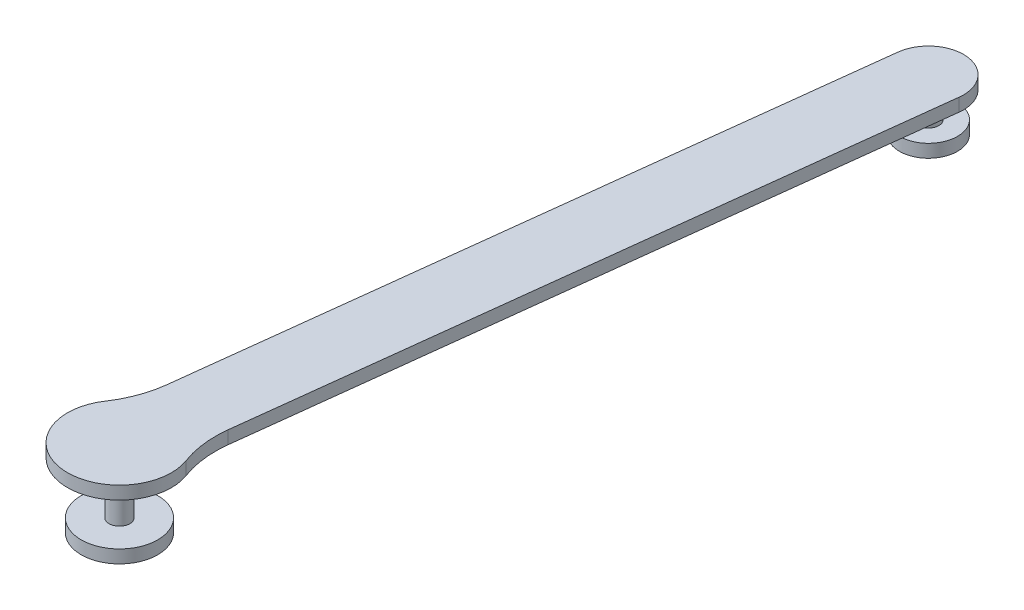
ISO-10303-21;
HEADER;
FILE_DESCRIPTION(('STEP AP214'),'2;1');
FILE_NAME('part.step','',(''),(''),'','','');
FILE_SCHEMA(('AUTOMOTIVE_DESIGN { 1 0 10303 214 1 1 1 1 }'));
ENDSEC;
DATA;
#1=APPLICATION_CONTEXT('core data for automotive mechanical design processes');
#2=APPLICATION_PROTOCOL_DEFINITION('international standard','automotive_design',2000,#1);
#3=PRODUCT_CONTEXT('',#1,'mechanical');
#4=PRODUCT('Part','Part','',(#3));
#5=PRODUCT_RELATED_PRODUCT_CATEGORY('part','',(#4));
#6=PRODUCT_DEFINITION_FORMATION('','',#4);
#7=PRODUCT_DEFINITION_CONTEXT('part definition',#1,'design');
#8=PRODUCT_DEFINITION('design','',#6,#7);
#9=PRODUCT_DEFINITION_SHAPE('','',#8);
#10=(LENGTH_UNIT() NAMED_UNIT(*) SI_UNIT(.MILLI.,.METRE.));
#11=(NAMED_UNIT(*) PLANE_ANGLE_UNIT() SI_UNIT($,.RADIAN.));
#12=(NAMED_UNIT(*) SI_UNIT($,.STERADIAN.) SOLID_ANGLE_UNIT());
#13=UNCERTAINTY_MEASURE_WITH_UNIT(LENGTH_MEASURE(1.E-05),#10,'distance_accuracy_value','');
#14=(GEOMETRIC_REPRESENTATION_CONTEXT(3) GLOBAL_UNCERTAINTY_ASSIGNED_CONTEXT((#13)) GLOBAL_UNIT_ASSIGNED_CONTEXT((#10,
#11,#12)) REPRESENTATION_CONTEXT('',''));
#15=CARTESIAN_POINT('',(0.,0.,0.));
#16=DIRECTION('',(0.,0.,1.));
#17=DIRECTION('',(1.,0.,0.));
#18=AXIS2_PLACEMENT_3D('',#15,#16,#17);
#19=CARTESIAN_POINT('',(25.654,-53.3974683301547,-3.78135023293425E-11));
#20=DIRECTION('',(0.,1.,0.));
#21=DIRECTION('',(-1.,0.,0.));
#22=AXIS2_PLACEMENT_3D('',#19,#20,#21);
#23=CYLINDRICAL_SURFACE('',#22,1.016);
#24=CARTESIAN_POINT('',(25.654,-50.8574683301547,-3.78135023293425E-11));
#25=DIRECTION('',(0.,-1.,0.));
#26=DIRECTION('',(1.,0.,0.));
#27=AXIS2_PLACEMENT_3D('',#24,#25,#26);
#28=CIRCLE('',#27,1.016);
#29=CARTESIAN_POINT('',(24.638,-50.8574683301547,-3.78135023293425E-11));
#30=VERTEX_POINT('',#29);
#31=EDGE_CURVE('E11',#30,#30,#28,.F.);
#32=CARTESIAN_POINT('',(25.654,-53.3974683301547,-3.78135023293425E-11));
#33=DIRECTION('',(0.,1.,0.));
#34=DIRECTION('',(-1.,0.,0.));
#35=AXIS2_PLACEMENT_3D('',#32,#33,#34);
#36=CIRCLE('',#35,1.016);
#37=CARTESIAN_POINT('',(24.638,-53.3974683301547,-3.78135023293425E-11));
#38=VERTEX_POINT('',#37);
#39=EDGE_CURVE('E134',#38,#38,#36,.T.);
#40=CARTESIAN_POINT('',(24.638,-50.8574683301547,-3.78135023293425E-11));
#41=CARTESIAN_POINT('',(24.638,-50.883926663488,-3.78135023293425E-11));
#42=CARTESIAN_POINT('',(24.638,-50.9103849968213,-3.78135023293425E-11));
#43=CARTESIAN_POINT('',(24.638,-50.963301663488,-3.78135023293425E-11));
#44=CARTESIAN_POINT('',(24.638,-50.9897599968213,-3.78135023293425E-11));
#45=CARTESIAN_POINT('',(24.638,-51.042676663488,-3.78135023293425E-11));
#46=CARTESIAN_POINT('',(24.638,-51.0691349968213,-3.78135023293425E-11));
#47=CARTESIAN_POINT('',(24.638,-51.122051663488,-3.78135023293425E-11));
#48=CARTESIAN_POINT('',(24.638,-51.1485099968213,-3.78135023293425E-11));
#49=CARTESIAN_POINT('',(24.638,-51.201426663488,-3.78135023293425E-11));
#50=CARTESIAN_POINT('',(24.638,-51.2278849968213,-3.78135023293425E-11));
#51=CARTESIAN_POINT('',(24.638,-51.280801663488,-3.78135023293425E-11));
#52=CARTESIAN_POINT('',(24.638,-51.3072599968213,-3.78135023293425E-11));
#53=CARTESIAN_POINT('',(24.638,-51.360176663488,-3.78135023293425E-11));
#54=CARTESIAN_POINT('',(24.638,-51.3866349968213,-3.78135023293425E-11));
#55=CARTESIAN_POINT('',(24.638,-51.439551663488,-3.78135023293425E-11));
#56=CARTESIAN_POINT('',(24.638,-51.4660099968213,-3.78135023293425E-11));
#57=CARTESIAN_POINT('',(24.638,-51.518926663488,-3.78135023293425E-11));
#58=CARTESIAN_POINT('',(24.638,-51.5453849968213,-3.78135023293425E-11));
#59=CARTESIAN_POINT('',(24.638,-51.598301663488,-3.78135023293425E-11));
#60=CARTESIAN_POINT('',(24.638,-51.6247599968213,-3.78135023293425E-11));
#61=CARTESIAN_POINT('',(24.638,-51.677676663488,-3.78135023293425E-11));
#62=CARTESIAN_POINT('',(24.638,-51.7041349968213,-3.78135023293425E-11));
#63=CARTESIAN_POINT('',(24.638,-51.757051663488,-3.78135023293425E-11));
#64=CARTESIAN_POINT('',(24.638,-51.7835099968213,-3.78135023293425E-11));
#65=CARTESIAN_POINT('',(24.638,-51.836426663488,-3.78135023293425E-11));
#66=CARTESIAN_POINT('',(24.638,-51.8628849968213,-3.78135023293425E-11));
#67=CARTESIAN_POINT('',(24.638,-51.915801663488,-3.78135023293425E-11));
#68=CARTESIAN_POINT('',(24.638,-51.9422599968213,-3.78135023293425E-11));
#69=CARTESIAN_POINT('',(24.638,-51.995176663488,-3.78135023293425E-11));
#70=CARTESIAN_POINT('',(24.638,-52.0216349968213,-3.78135023293425E-11));
#71=CARTESIAN_POINT('',(24.638,-52.074551663488,-3.78135023293425E-11));
#72=CARTESIAN_POINT('',(24.638,-52.1010099968213,-3.78135023293425E-11));
#73=CARTESIAN_POINT('',(24.638,-52.153926663488,-3.78135023293425E-11));
#74=CARTESIAN_POINT('',(24.638,-52.1803849968213,-3.78135023293425E-11));
#75=CARTESIAN_POINT('',(24.638,-52.233301663488,-3.78135023293425E-11));
#76=CARTESIAN_POINT('',(24.638,-52.2597599968213,-3.78135023293425E-11));
#77=CARTESIAN_POINT('',(24.638,-52.312676663488,-3.78135023293425E-11));
#78=CARTESIAN_POINT('',(24.638,-52.3391349968213,-3.78135023293425E-11));
#79=CARTESIAN_POINT('',(24.638,-52.392051663488,-3.78135023293425E-11));
#80=CARTESIAN_POINT('',(24.638,-52.4185099968213,-3.78135023293425E-11));
#81=CARTESIAN_POINT('',(24.638,-52.471426663488,-3.78135023293425E-11));
#82=CARTESIAN_POINT('',(24.638,-52.4978849968213,-3.78135023293425E-11));
#83=CARTESIAN_POINT('',(24.638,-52.550801663488,-3.78135023293425E-11));
#84=CARTESIAN_POINT('',(24.638,-52.5772599968213,-3.78135023293425E-11));
#85=CARTESIAN_POINT('',(24.638,-52.630176663488,-3.78135023293425E-11));
#86=CARTESIAN_POINT('',(24.638,-52.6566349968213,-3.78135023293425E-11));
#87=CARTESIAN_POINT('',(24.638,-52.709551663488,-3.78135023293425E-11));
#88=CARTESIAN_POINT('',(24.638,-52.7360099968213,-3.78135023293425E-11));
#89=CARTESIAN_POINT('',(24.638,-52.788926663488,-3.78135023293425E-11));
#90=CARTESIAN_POINT('',(24.638,-52.8153849968213,-3.78135023293425E-11));
#91=CARTESIAN_POINT('',(24.638,-52.868301663488,-3.78135023293425E-11));
#92=CARTESIAN_POINT('',(24.638,-52.8947599968213,-3.78135023293425E-11));
#93=CARTESIAN_POINT('',(24.638,-52.947676663488,-3.78135023293425E-11));
#94=CARTESIAN_POINT('',(24.638,-52.9741349968213,-3.78135023293425E-11));
#95=CARTESIAN_POINT('',(24.638,-53.027051663488,-3.78135023293425E-11));
#96=CARTESIAN_POINT('',(24.638,-53.0535099968213,-3.78135023293425E-11));
#97=CARTESIAN_POINT('',(24.638,-53.106426663488,-3.78135023293425E-11));
#98=CARTESIAN_POINT('',(24.638,-53.1328849968213,-3.78135023293425E-11));
#99=CARTESIAN_POINT('',(24.638,-53.185801663488,-3.78135023293425E-11));
#100=CARTESIAN_POINT('',(24.638,-53.2122599968213,-3.78135023293425E-11));
#101=CARTESIAN_POINT('',(24.638,-53.265176663488,-3.78135023293425E-11));
#102=CARTESIAN_POINT('',(24.638,-53.2916349968213,-3.78135023293425E-11));
#103=CARTESIAN_POINT('',(24.638,-53.344551663488,-3.78135023293425E-11));
#104=CARTESIAN_POINT('',(24.638,-53.3710099968213,-3.78135023293425E-11));
#105=CARTESIAN_POINT('',(24.638,-53.3974683301547,-3.78135023293425E-11));
#106=B_SPLINE_CURVE_WITH_KNOTS('',3,(#40,#41,#42,#43,#44,#45,#46,#47,#48,#49,#50,#51,#52,#53,
#54,#55,#56,#57,#58,#59,#60,#61,#62,#63,#64,#65,#66,#67,#68,#69,#70,#71,#72,#73,#74,#75,#76,#77,
#78,#79,#80,#81,#82,#83,#84,#85,#86,#87,#88,#89,#90,#91,#92,#93,#94,#95,#96,#97,#98,#99,#100,
#101,#102,#103,#104,#105),.UNSPECIFIED.,.F.,.F.,(4,2,2,2,2,2,2,2,2,2,2,2,2,2,2,2,2,2,2,2,2,2,2,
2,2,2,2,2,2,2,2,2,4),(0.,0.0793749999999996,0.158749999999999,0.238124999999999,
0.317499999999998,0.396874999999998,0.476249999999998,0.555624999999997,0.634999999999997,
0.714374999999996,0.793749999999996,0.873124999999995,0.952499999999995,1.03187499999999,
1.11124999999999,1.19062499999999,1.27,1.349375,1.42875,1.508125,1.5875,1.666875,1.74625,
1.825625,1.905,1.984375,2.06375,2.143125,2.2225,2.301875,2.38124999999999,2.46062499999999,
2.54),.UNSPECIFIED.);
#107=EDGE_CURVE('BSEAM41',#30,#38,#106,.T.);
#108=ORIENTED_EDGE('',*,*,#31,.F.);
#109=ORIENTED_EDGE('',*,*,#39,.T.);
#110=ORIENTED_EDGE('',*,*,#107,.T.);
#111=ORIENTED_EDGE('',*,*,#107,.F.);
#112=EDGE_LOOP('',(#108,#110,#109,#111));
#113=FACE_BOUND('',#112,.T.);
#114=ADVANCED_FACE('F41',(#113),#23,.T.);
#115=CARTESIAN_POINT('',(25.654,-50.8574683301547,-3.78135023293424E-11));
#116=DIRECTION('',(0.,-1.,0.));
#117=DIRECTION('',(1.,0.,0.));
#118=AXIS2_PLACEMENT_3D('',#115,#116,#117);
#119=PLANE('',#118);
#120=CARTESIAN_POINT('',(17.272,-50.8574683301547,70.7182535302327));
#121=DIRECTION('',(0.,-1.,0.));
#122=DIRECTION('',(1.,0.,0.));
#123=AXIS2_PLACEMENT_3D('',#120,#121,#122);
#124=CIRCLE('',#123,1.01599999999988);
#125=CARTESIAN_POINT('',(18.2879999999999,-50.8574683301547,70.7182535302327));
#126=VERTEX_POINT('',#125);
#127=EDGE_CURVE('E154',#126,#126,#124,.T.);
#128=ORIENTED_EDGE('',*,*,#127,.F.);
#129=EDGE_LOOP('',(#128));
#130=FACE_BOUND('',#129,.T.);
#131=CARTESIAN_POINT('',(25.654,-50.8574683301547,-3.78135023293424E-11));
#132=DIRECTION('',(0.,-1.,0.));
#133=DIRECTION('',(1.,0.,0.));
#134=AXIS2_PLACEMENT_3D('',#131,#132,#133);
#135=CIRCLE('',#134,3.429);
#136=CARTESIAN_POINT('',(22.2488354325944,-50.8574683301547,-0.403602860390931));
#137=VERTEX_POINT('',#136);
#138=CARTESIAN_POINT('',(29.0591645674056,-50.8574683301547,0.403602860315304));
#139=VERTEX_POINT('',#138);
#140=EDGE_CURVE('E100',#137,#139,#135,.T.);
#141=ORIENTED_EDGE('',*,*,#140,.T.);
#142=DIRECTION('',(-0.117702788087815,0.,0.993048867718178));
#143=VECTOR('',#142,1.);
#144=CARTESIAN_POINT('',(29.0591645674056,-50.8574683301547,0.403602860315304));
#145=LINE('',#144,#143);
#146=CARTESIAN_POINT('',(21.4846808329558,-50.8574683301547,64.3089072141369));
#147=VERTEX_POINT('',#146);
#148=EDGE_CURVE('E91',#139,#147,#145,.T.);
#149=ORIENTED_EDGE('',*,*,#148,.T.);
#150=CARTESIAN_POINT('',(31.4151695101375,-50.8574683301547,65.4859350950151));
#151=DIRECTION('',(0.,-1.,0.));
#152=DIRECTION('',(1.,0.,0.));
#153=AXIS2_PLACEMENT_3D('',#150,#151,#152);
#154=CIRCLE('',#153,10.);
#155=CARTESIAN_POINT('',(22.0364098880305,-50.8574683301547,68.9556422801726));
#156=VERTEX_POINT('',#155);
#157=EDGE_CURVE('E48',#147,#156,#154,.F.);
#158=ORIENTED_EDGE('',*,*,#157,.T.);
#159=CARTESIAN_POINT('',(17.272,-50.8574683301547,70.7182535302327));
#160=DIRECTION('',(0.,-1.,0.));
#161=DIRECTION('',(1.,0.,0.));
#162=AXIS2_PLACEMENT_3D('',#159,#160,#161);
#163=CIRCLE('',#162,5.0800000000001);
#164=CARTESIAN_POINT('',(13.0516461635603,-50.8574683301547,67.8907080407224));
#165=VERTEX_POINT('',#164);
#166=EDGE_CURVE('E99',#156,#165,#163,.T.);
#167=ORIENTED_EDGE('',*,*,#166,.T.);
#168=CARTESIAN_POINT('',(4.74386302096273,-50.8574683301547,62.3246736125526));
#169=DIRECTION('',(0.,-1.,0.));
#170=DIRECTION('',(1.,0.,0.));
#171=AXIS2_PLACEMENT_3D('',#168,#169,#170);
#172=CIRCLE('',#171,10.);
#173=CARTESIAN_POINT('',(14.6743516981445,-50.8574683301547,63.5017014934308));
#174=VERTEX_POINT('',#173);
#175=EDGE_CURVE('E131',#165,#174,#172,.F.);
#176=ORIENTED_EDGE('',*,*,#175,.T.);
#177=DIRECTION('',(0.117702788087815,0.,-0.993048867718178));
#178=VECTOR('',#177,1.);
#179=CARTESIAN_POINT('',(22.2488354325944,-50.8574683301547,-0.403602860390931));
#180=LINE('',#179,#178);
#181=EDGE_CURVE('E106',#174,#137,#180,.T.);
#182=ORIENTED_EDGE('',*,*,#181,.T.);
#183=EDGE_LOOP('',(#141,#149,#158,#167,#176,#182));
#184=FACE_BOUND('',#183,.T.);
#185=ORIENTED_EDGE('',*,*,#31,.T.);
#186=EDGE_LOOP('',(#185));
#187=FACE_BOUND('',#186,.T.);
#188=ADVANCED_FACE('F103',(#130,#184,#187),#119,.T.);
#189=CARTESIAN_POINT('',(25.654,-50.8574683301547,-3.78135023293424E-11));
#190=DIRECTION('',(0.,1.,0.));
#191=DIRECTION('',(-1.,0.,0.));
#192=AXIS2_PLACEMENT_3D('',#189,#190,#191);
#193=CYLINDRICAL_SURFACE('',#192,3.429);
#194=CARTESIAN_POINT('',(25.654,-49.5874683301547,-3.78135023293424E-11));
#195=DIRECTION('',(0.,-1.,0.));
#196=DIRECTION('',(1.,0.,0.));
#197=AXIS2_PLACEMENT_3D('',#194,#195,#196);
#198=CIRCLE('',#197,3.429);
#199=CARTESIAN_POINT('',(22.2488354325944,-49.5874683301547,-0.403602860390931));
#200=VERTEX_POINT('',#199);
#201=CARTESIAN_POINT('',(29.0591645674056,-49.5874683301547,0.403602860315304));
#202=VERTEX_POINT('',#201);
#203=EDGE_CURVE('E114',#200,#202,#198,.T.);
#204=ORIENTED_EDGE('',*,*,#203,.T.);
#205=DIRECTION('',(0.,1.,0.));
#206=VECTOR('',#205,1.);
#207=CARTESIAN_POINT('',(29.0591645674056,-50.8574683301547,0.403602860315304));
#208=LINE('',#207,#206);
#209=EDGE_CURVE('E95',#139,#202,#208,.T.);
#210=ORIENTED_EDGE('',*,*,#209,.F.);
#211=ORIENTED_EDGE('',*,*,#140,.F.);
#212=DIRECTION('',(0.,1.,0.));
#213=VECTOR('',#212,1.);
#214=CARTESIAN_POINT('',(22.2488354325944,-50.8574683301547,-0.403602860390931));
#215=LINE('',#214,#213);
#216=EDGE_CURVE('E116',#137,#200,#215,.T.);
#217=ORIENTED_EDGE('',*,*,#216,.T.);
#218=EDGE_LOOP('',(#204,#210,#211,#217));
#219=FACE_BOUND('',#218,.T.);
#220=ADVANCED_FACE('F112',(#219),#193,.T.);
#221=CARTESIAN_POINT('',(29.0591645674056,-50.8574683301547,0.403602860315304));
#222=DIRECTION('',(-0.993048867718178,0.,-0.117702788087815));
#223=DIRECTION('',(-0.117702788087815,0.,0.993048867718178));
#224=AXIS2_PLACEMENT_3D('',#221,#222,#223);
#225=PLANE('',#224);
#226=DIRECTION('',(-0.117702788087815,0.,0.993048867718178));
#227=VECTOR('',#226,1.);
#228=CARTESIAN_POINT('',(29.0591645674056,-49.5874683301547,0.403602860315304));
#229=LINE('',#228,#227);
#230=CARTESIAN_POINT('',(21.4846808329558,-49.5874683301547,64.3089072141369));
#231=VERTEX_POINT('',#230);
#232=EDGE_CURVE('E163',#202,#231,#229,.T.);
#233=ORIENTED_EDGE('',*,*,#232,.T.);
#234=DIRECTION('',(0.,-1.,0.));
#235=VECTOR('',#234,1.);
#236=CARTESIAN_POINT('',(21.4846808329558,-50.8574683301547,64.3089072141369));
#237=LINE('',#236,#235);
#238=EDGE_CURVE('E55',#231,#147,#237,.T.);
#239=ORIENTED_EDGE('',*,*,#238,.T.);
#240=ORIENTED_EDGE('',*,*,#148,.F.);
#241=ORIENTED_EDGE('',*,*,#209,.T.);
#242=EDGE_LOOP('',(#233,#239,#240,#241));
#243=FACE_BOUND('',#242,.T.);
#244=ADVANCED_FACE('F93',(#243),#225,.F.);
#245=CARTESIAN_POINT('',(17.272,-50.8574683301547,70.7182535302327));
#246=DIRECTION('',(0.,1.,0.));
#247=DIRECTION('',(-1.,0.,0.));
#248=AXIS2_PLACEMENT_3D('',#245,#246,#247);
#249=CYLINDRICAL_SURFACE('',#248,5.0800000000001);
#250=CARTESIAN_POINT('',(17.272,-49.5874683301547,70.7182535302327));
#251=DIRECTION('',(0.,-1.,0.));
#252=DIRECTION('',(1.,0.,0.));
#253=AXIS2_PLACEMENT_3D('',#250,#251,#252);
#254=CIRCLE('',#253,5.0800000000001);
#255=CARTESIAN_POINT('',(22.0364098880305,-49.5874683301547,68.9556422801726));
#256=VERTEX_POINT('',#255);
#257=CARTESIAN_POINT('',(13.0516461635603,-49.5874683301547,67.8907080407224));
#258=VERTEX_POINT('',#257);
#259=EDGE_CURVE('E165',#256,#258,#254,.T.);
#260=ORIENTED_EDGE('',*,*,#259,.T.);
#261=DIRECTION('',(0.,1.,0.));
#262=VECTOR('',#261,1.);
#263=CARTESIAN_POINT('',(13.0516461635603,-50.8574683301547,67.8907080407224));
#264=LINE('',#263,#262);
#265=EDGE_CURVE('E126',#258,#165,#264,.F.);
#266=ORIENTED_EDGE('',*,*,#265,.T.);
#267=ORIENTED_EDGE('',*,*,#166,.F.);
#268=DIRECTION('',(0.,1.,0.));
#269=VECTOR('',#268,1.);
#270=CARTESIAN_POINT('',(22.0364098880305,-50.8574683301547,68.9556422801726));
#271=LINE('',#270,#269);
#272=EDGE_CURVE('E119',#156,#256,#271,.T.);
#273=ORIENTED_EDGE('',*,*,#272,.T.);
#274=EDGE_LOOP('',(#260,#266,#267,#273));
#275=FACE_BOUND('',#274,.T.);
#276=ADVANCED_FACE('F178',(#275),#249,.T.);
#277=CARTESIAN_POINT('',(22.2488354325944,-50.8574683301547,-0.403602860390931));
#278=DIRECTION('',(0.993048867718178,0.,0.117702788087815));
#279=DIRECTION('',(0.117702788087815,0.,-0.993048867718178));
#280=AXIS2_PLACEMENT_3D('',#277,#278,#279);
#281=PLANE('',#280);
#282=ORIENTED_EDGE('',*,*,#181,.F.);
#283=DIRECTION('',(0.,-1.,0.));
#284=VECTOR('',#283,1.);
#285=CARTESIAN_POINT('',(14.6743516981445,-49.5874683301547,63.5017014934308));
#286=LINE('',#285,#284);
#287=CARTESIAN_POINT('',(14.6743516981445,-49.5874683301547,63.5017014934308));
#288=VERTEX_POINT('',#287);
#289=EDGE_CURVE('E115',#174,#288,#286,.F.);
#290=ORIENTED_EDGE('',*,*,#289,.T.);
#291=DIRECTION('',(0.117702788087815,0.,-0.993048867718178));
#292=VECTOR('',#291,1.);
#293=CARTESIAN_POINT('',(22.2488354325944,-49.5874683301547,-0.403602860390931));
#294=LINE('',#293,#292);
#295=EDGE_CURVE('E110',#288,#200,#294,.T.);
#296=ORIENTED_EDGE('',*,*,#295,.T.);
#297=ORIENTED_EDGE('',*,*,#216,.F.);
#298=EDGE_LOOP('',(#282,#290,#296,#297));
#299=FACE_BOUND('',#298,.T.);
#300=ADVANCED_FACE('F169',(#299),#281,.F.);
#301=CARTESIAN_POINT('',(4.74386302096273,-50.8574683301547,62.3246736125526));
#302=DIRECTION('',(0.,1.,0.));
#303=DIRECTION('',(-1.,0.,0.));
#304=AXIS2_PLACEMENT_3D('',#301,#302,#303);
#305=CYLINDRICAL_SURFACE('',#304,10.);
#306=ORIENTED_EDGE('',*,*,#175,.F.);
#307=ORIENTED_EDGE('',*,*,#265,.F.);
#308=CARTESIAN_POINT('',(4.74386302096273,-49.5874683301547,62.3246736125526));
#309=DIRECTION('',(0.,-1.,0.));
#310=DIRECTION('',(1.,0.,0.));
#311=AXIS2_PLACEMENT_3D('',#308,#309,#310);
#312=CIRCLE('',#311,10.);
#313=EDGE_CURVE('E129',#288,#258,#312,.T.);
#314=ORIENTED_EDGE('',*,*,#313,.F.);
#315=ORIENTED_EDGE('',*,*,#289,.F.);
#316=EDGE_LOOP('',(#306,#307,#314,#315));
#317=FACE_BOUND('',#316,.T.);
#318=ADVANCED_FACE('F181',(#317),#305,.F.);
#319=CARTESIAN_POINT('',(31.4151695101375,-50.8574683301547,65.4859350950151));
#320=DIRECTION('',(0.,1.,0.));
#321=DIRECTION('',(-1.,0.,0.));
#322=AXIS2_PLACEMENT_3D('',#319,#320,#321);
#323=CYLINDRICAL_SURFACE('',#322,10.);
#324=ORIENTED_EDGE('',*,*,#157,.F.);
#325=ORIENTED_EDGE('',*,*,#238,.F.);
#326=CARTESIAN_POINT('',(31.4151695101375,-49.5874683301547,65.4859350950151));
#327=DIRECTION('',(0.,-1.,0.));
#328=DIRECTION('',(1.,0.,0.));
#329=AXIS2_PLACEMENT_3D('',#326,#327,#328);
#330=CIRCLE('',#329,10.);
#331=EDGE_CURVE('E63',#256,#231,#330,.T.);
#332=ORIENTED_EDGE('',*,*,#331,.F.);
#333=ORIENTED_EDGE('',*,*,#272,.F.);
#334=EDGE_LOOP('',(#324,#325,#332,#333));
#335=FACE_BOUND('',#334,.T.);
#336=ADVANCED_FACE('F173',(#335),#323,.F.);
#337=CARTESIAN_POINT('',(17.272,-57.2074683301547,70.7182535302326));
#338=DIRECTION('',(0.,1.,0.));
#339=DIRECTION('',(-1.,0.,0.));
#340=AXIS2_PLACEMENT_3D('',#337,#338,#339);
#341=CYLINDRICAL_SURFACE('',#340,3.74327184516675);
#342=CARTESIAN_POINT('',(17.272,-57.2074683301547,70.7182535302326));
#343=DIRECTION('',(0.,-1.,0.));
#344=DIRECTION('',(1.,0.,0.));
#345=AXIS2_PLACEMENT_3D('',#342,#343,#344);
#346=CIRCLE('',#345,3.74327184516675);
#347=CARTESIAN_POINT('',(21.0152718451667,-57.2074683301547,70.7182535302326));
#348=VERTEX_POINT('',#347);
#349=EDGE_CURVE('E141',#348,#348,#346,.T.);
#350=ORIENTED_EDGE('',*,*,#349,.F.);
#351=EDGE_LOOP('',(#350));
#352=FACE_BOUND('',#351,.T.);
#353=CARTESIAN_POINT('',(17.272,-55.9374683301547,70.7182535302326));
#354=DIRECTION('',(0.,-1.,0.));
#355=DIRECTION('',(1.,0.,0.));
#356=AXIS2_PLACEMENT_3D('',#353,#354,#355);
#357=CIRCLE('',#356,3.74327184516675);
#358=CARTESIAN_POINT('',(21.0152718451667,-55.9374683301547,70.7182535302326));
#359=VERTEX_POINT('',#358);
#360=EDGE_CURVE('E136',#359,#359,#357,.T.);
#361=ORIENTED_EDGE('',*,*,#360,.T.);
#362=EDGE_LOOP('',(#361));
#363=FACE_BOUND('',#362,.T.);
#364=ADVANCED_FACE('F189',(#352,#363),#341,.T.);
#365=CARTESIAN_POINT('',(17.272,-57.2074683301547,70.7182535302326));
#366=DIRECTION('',(0.,-1.,0.));
#367=DIRECTION('',(1.,0.,0.));
#368=AXIS2_PLACEMENT_3D('',#365,#366,#367);
#369=PLANE('',#368);
#370=ORIENTED_EDGE('',*,*,#349,.T.);
#371=EDGE_LOOP('',(#370));
#372=FACE_BOUND('',#371,.T.);
#373=ADVANCED_FACE('F261',(#372),#369,.T.);
#374=CARTESIAN_POINT('',(17.272,-55.9374683301547,70.7182535302326));
#375=DIRECTION('',(0.,-1.,0.));
#376=DIRECTION('',(1.,0.,0.));
#377=AXIS2_PLACEMENT_3D('',#374,#375,#376);
#378=PLANE('',#377);
#379=CARTESIAN_POINT('',(17.272,-55.9374683301547,70.7182535302326));
#380=DIRECTION('',(0.,1.,0.));
#381=DIRECTION('',(-1.,0.,0.));
#382=AXIS2_PLACEMENT_3D('',#379,#380,#381);
#383=CIRCLE('',#382,1.016);
#384=CARTESIAN_POINT('',(16.256,-55.9374683301547,70.7182535302326));
#385=VERTEX_POINT('',#384);
#386=EDGE_CURVE('E151',#385,#385,#383,.T.);
#387=ORIENTED_EDGE('',*,*,#386,.F.);
#388=EDGE_LOOP('',(#387));
#389=FACE_BOUND('',#388,.T.);
#390=ORIENTED_EDGE('',*,*,#360,.F.);
#391=EDGE_LOOP('',(#390));
#392=FACE_BOUND('',#391,.T.);
#393=ADVANCED_FACE('F271',(#389,#392),#378,.F.);
#394=CARTESIAN_POINT('',(17.272,-55.9374683301547,70.7182535302326));
#395=DIRECTION('',(0.,1.,0.));
#396=DIRECTION('',(-1.,0.,0.));
#397=AXIS2_PLACEMENT_3D('',#394,#395,#396);
#398=CYLINDRICAL_SURFACE('',#397,1.016);
#399=ORIENTED_EDGE('',*,*,#127,.T.);
#400=EDGE_LOOP('',(#399));
#401=FACE_BOUND('',#400,.T.);
#402=ORIENTED_EDGE('',*,*,#386,.T.);
#403=EDGE_LOOP('',(#402));
#404=FACE_BOUND('',#403,.T.);
#405=ADVANCED_FACE('F281',(#401,#404),#398,.T.);
#406=CARTESIAN_POINT('',(25.654,-49.5874683301547,-3.78135023293425E-11));
#407=DIRECTION('',(0.,1.,0.));
#408=DIRECTION('',(-1.,0.,0.));
#409=AXIS2_PLACEMENT_3D('',#406,#407,#408);
#410=PLANE('',#409);
#411=ORIENTED_EDGE('',*,*,#203,.F.);
#412=ORIENTED_EDGE('',*,*,#295,.F.);
#413=ORIENTED_EDGE('',*,*,#313,.T.);
#414=ORIENTED_EDGE('',*,*,#259,.F.);
#415=ORIENTED_EDGE('',*,*,#331,.T.);
#416=ORIENTED_EDGE('',*,*,#232,.F.);
#417=EDGE_LOOP('',(#411,#412,#413,#414,#415,#416));
#418=FACE_BOUND('',#417,.T.);
#419=ADVANCED_FACE('F171',(#418),#410,.T.);
#420=CARTESIAN_POINT('',(25.654,-54.6674683301547,-3.78169717762944E-11));
#421=DIRECTION('',(0.,1.,0.));
#422=DIRECTION('',(-1.,0.,0.));
#423=AXIS2_PLACEMENT_3D('',#420,#421,#422);
#424=CYLINDRICAL_SURFACE('',#423,2.83682890842096);
#425=CARTESIAN_POINT('',(25.654,-54.6674683301547,-3.78169717762944E-11));
#426=DIRECTION('',(0.,-1.,0.));
#427=DIRECTION('',(1.,0.,0.));
#428=AXIS2_PLACEMENT_3D('',#425,#426,#427);
#429=CIRCLE('',#428,2.83682890842096);
#430=CARTESIAN_POINT('',(28.490828908421,-54.6674683301547,-3.78169717762944E-11));
#431=VERTEX_POINT('',#430);
#432=EDGE_CURVE('E137',#431,#431,#429,.T.);
#433=ORIENTED_EDGE('',*,*,#432,.F.);
#434=EDGE_LOOP('',(#433));
#435=FACE_BOUND('',#434,.T.);
#436=CARTESIAN_POINT('',(25.654,-53.3974683301547,-3.78169717762944E-11));
#437=DIRECTION('',(0.,-1.,0.));
#438=DIRECTION('',(1.,0.,0.));
#439=AXIS2_PLACEMENT_3D('',#436,#437,#438);
#440=CIRCLE('',#439,2.83682890842096);
#441=CARTESIAN_POINT('',(28.490828908421,-53.3974683301547,-3.78169717762944E-11));
#442=VERTEX_POINT('',#441);
#443=EDGE_CURVE('E144',#442,#442,#440,.T.);
#444=ORIENTED_EDGE('',*,*,#443,.T.);
#445=EDGE_LOOP('',(#444));
#446=FACE_BOUND('',#445,.T.);
#447=ADVANCED_FACE('F299',(#435,#446),#424,.T.);
#448=CARTESIAN_POINT('',(25.654,-54.6674683301547,-3.78169717762944E-11));
#449=DIRECTION('',(0.,-1.,0.));
#450=DIRECTION('',(1.,0.,0.));
#451=AXIS2_PLACEMENT_3D('',#448,#449,#450);
#452=PLANE('',#451);
#453=ORIENTED_EDGE('',*,*,#432,.T.);
#454=EDGE_LOOP('',(#453));
#455=FACE_BOUND('',#454,.T.);
#456=ADVANCED_FACE('F308',(#455),#452,.T.);
#457=CARTESIAN_POINT('',(25.654,-53.3974683301547,-3.78169717762944E-11));
#458=DIRECTION('',(0.,-1.,0.));
#459=DIRECTION('',(1.,0.,0.));
#460=AXIS2_PLACEMENT_3D('',#457,#458,#459);
#461=PLANE('',#460);
#462=ORIENTED_EDGE('',*,*,#39,.F.);
#463=EDGE_LOOP('',(#462));
#464=FACE_BOUND('',#463,.T.);
#465=ORIENTED_EDGE('',*,*,#443,.F.);
#466=EDGE_LOOP('',(#465));
#467=FACE_BOUND('',#466,.T.);
#468=ADVANCED_FACE('F318',(#464,#467),#461,.F.);
#469=CLOSED_SHELL('',(#114,#188,#220,#244,#276,#300,#318,#336,#364,#373,#393,#405,#419,#447,
#456,#468));
#470=MANIFOLD_SOLID_BREP('B2',#469);
#471=ADVANCED_BREP_SHAPE_REPRESENTATION('',(#18,#470),#14);
#472=SHAPE_DEFINITION_REPRESENTATION(#9,#471);
ENDSEC;
END-ISO-10303-21;
